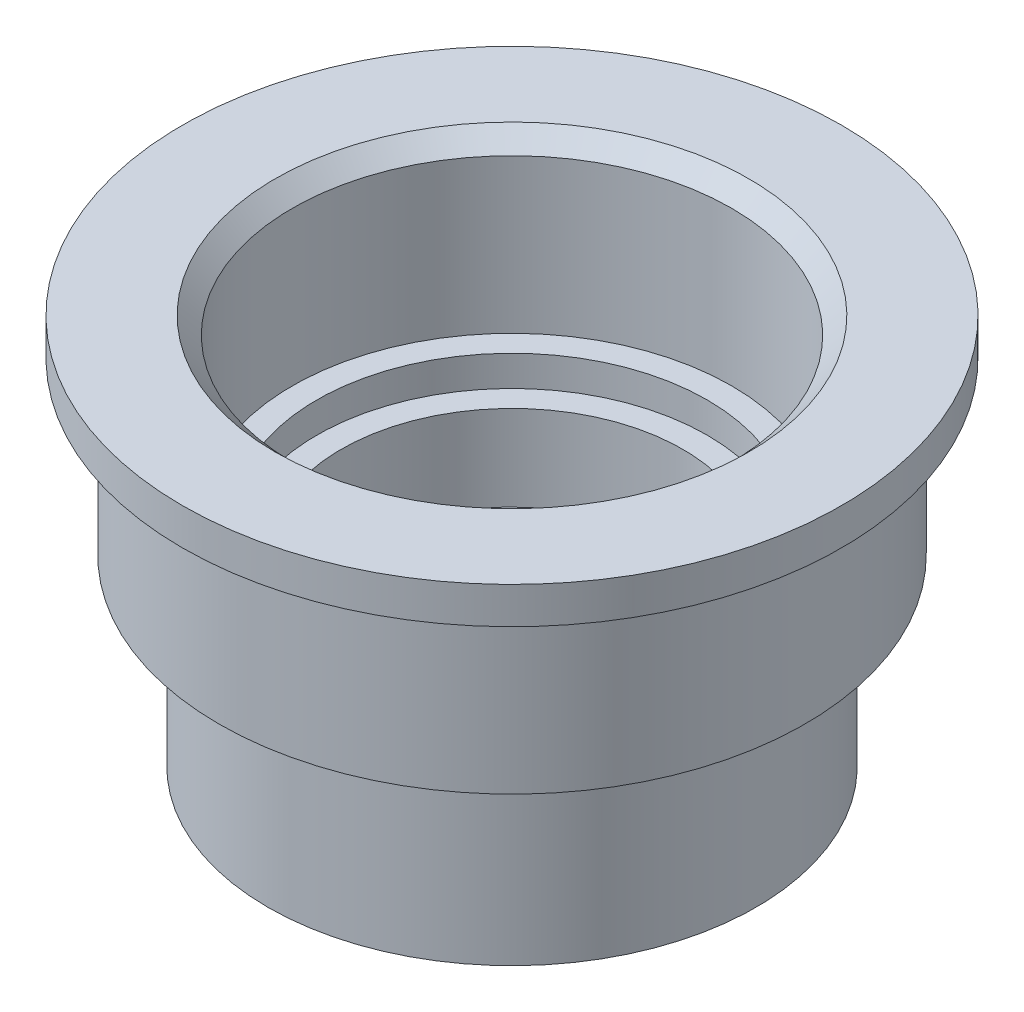
ISO-10303-21;
HEADER;
FILE_DESCRIPTION(('STEP AP214'),'2;1');
FILE_NAME('part.step','',(''),(''),'','','');
FILE_SCHEMA(('AUTOMOTIVE_DESIGN { 1 0 10303 214 1 1 1 1 }'));
ENDSEC;
DATA;
#1=APPLICATION_CONTEXT('core data for automotive mechanical design processes');
#2=APPLICATION_PROTOCOL_DEFINITION('international standard','automotive_design',2000,#1);
#3=PRODUCT_CONTEXT('',#1,'mechanical');
#4=PRODUCT('Part','Part','',(#3));
#5=PRODUCT_RELATED_PRODUCT_CATEGORY('part','',(#4));
#6=PRODUCT_DEFINITION_FORMATION('','',#4);
#7=PRODUCT_DEFINITION_CONTEXT('part definition',#1,'design');
#8=PRODUCT_DEFINITION('design','',#6,#7);
#9=PRODUCT_DEFINITION_SHAPE('','',#8);
#10=(LENGTH_UNIT() NAMED_UNIT(*) SI_UNIT(.MILLI.,.METRE.));
#11=(NAMED_UNIT(*) PLANE_ANGLE_UNIT() SI_UNIT($,.RADIAN.));
#12=(NAMED_UNIT(*) SI_UNIT($,.STERADIAN.) SOLID_ANGLE_UNIT());
#13=UNCERTAINTY_MEASURE_WITH_UNIT(LENGTH_MEASURE(1.E-05),#10,'distance_accuracy_value','');
#14=(GEOMETRIC_REPRESENTATION_CONTEXT(3) GLOBAL_UNCERTAINTY_ASSIGNED_CONTEXT((#13)) GLOBAL_UNIT_ASSIGNED_CONTEXT((#10,
#11,#12)) REPRESENTATION_CONTEXT('',''));
#15=CARTESIAN_POINT('',(0.,0.,0.));
#16=DIRECTION('',(0.,0.,1.));
#17=DIRECTION('',(1.,0.,0.));
#18=AXIS2_PLACEMENT_3D('',#15,#16,#17);
#19=CARTESIAN_POINT('',(0.,21.5,0.));
#20=DIRECTION('',(0.,-1.,0.));
#21=DIRECTION('',(0.,0.,-1.));
#22=AXIS2_PLACEMENT_3D('',#19,#20,#21);
#23=CYLINDRICAL_SURFACE('',#22,5.5);
#24=CARTESIAN_POINT('',(0.,0.,0.));
#25=DIRECTION('',(0.,-1.,0.));
#26=DIRECTION('',(0.,0.,-1.));
#27=AXIS2_PLACEMENT_3D('',#24,#25,#26);
#28=CIRCLE('',#27,5.5);
#29=CARTESIAN_POINT('',(0.,0.,-5.5));
#30=VERTEX_POINT('',#29);
#31=EDGE_CURVE('E76',#30,#30,#28,.T.);
#32=ORIENTED_EDGE('',*,*,#31,.T.);
#33=EDGE_LOOP('',(#32));
#34=FACE_BOUND('',#33,.T.);
#35=CARTESIAN_POINT('',(0.,4.25,0.));
#36=DIRECTION('',(0.,1.,0.));
#37=DIRECTION('',(0.,0.,1.));
#38=AXIS2_PLACEMENT_3D('',#35,#36,#37);
#39=CIRCLE('',#38,5.5);
#40=CARTESIAN_POINT('',(0.,4.25,5.5));
#41=VERTEX_POINT('',#40);
#42=EDGE_CURVE('E50',#41,#41,#39,.F.);
#43=ORIENTED_EDGE('',*,*,#42,.F.);
#44=EDGE_LOOP('',(#43));
#45=FACE_BOUND('',#44,.T.);
#46=ADVANCED_FACE('F45',(#34,#45),#23,.F.);
#47=CARTESIAN_POINT('',(0.,7.5,0.));
#48=DIRECTION('',(0.,-1.,0.));
#49=DIRECTION('',(0.,0.,-1.));
#50=AXIS2_PLACEMENT_3D('',#47,#48,#49);
#51=CYLINDRICAL_SURFACE('',#50,10.);
#52=CARTESIAN_POINT('',(0.,7.5,0.));
#53=DIRECTION('',(0.,1.,0.));
#54=DIRECTION('',(0.,0.,1.));
#55=AXIS2_PLACEMENT_3D('',#52,#53,#54);
#56=CIRCLE('',#55,10.);
#57=CARTESIAN_POINT('',(0.,7.5,10.));
#58=VERTEX_POINT('',#57);
#59=EDGE_CURVE('E58',#58,#58,#56,.T.);
#60=ORIENTED_EDGE('',*,*,#59,.F.);
#61=EDGE_LOOP('',(#60));
#62=FACE_BOUND('',#61,.T.);
#63=CARTESIAN_POINT('',(0.,0.,0.));
#64=DIRECTION('',(0.,1.,0.));
#65=DIRECTION('',(0.,0.,1.));
#66=AXIS2_PLACEMENT_3D('',#63,#64,#65);
#67=CIRCLE('',#66,10.);
#68=CARTESIAN_POINT('',(0.,0.,10.));
#69=VERTEX_POINT('',#68);
#70=EDGE_CURVE('E61',#69,#69,#67,.T.);
#71=ORIENTED_EDGE('',*,*,#70,.T.);
#72=EDGE_LOOP('',(#71));
#73=FACE_BOUND('',#72,.T.);
#74=ADVANCED_FACE('F103',(#62,#73),#51,.T.);
#75=CARTESIAN_POINT('',(0.,0.,0.));
#76=DIRECTION('',(0.,1.,0.));
#77=DIRECTION('',(0.,0.,1.));
#78=AXIS2_PLACEMENT_3D('',#75,#76,#77);
#79=PLANE('',#78);
#80=ORIENTED_EDGE('',*,*,#31,.F.);
#81=EDGE_LOOP('',(#80));
#82=FACE_BOUND('',#81,.T.);
#83=ORIENTED_EDGE('',*,*,#70,.F.);
#84=EDGE_LOOP('',(#83));
#85=FACE_BOUND('',#84,.T.);
#86=ADVANCED_FACE('F111',(#82,#85),#79,.F.);
#87=CARTESIAN_POINT('',(0.,14.5,0.));
#88=DIRECTION('',(0.,-1.,0.));
#89=DIRECTION('',(0.,0.,-1.));
#90=AXIS2_PLACEMENT_3D('',#87,#88,#89);
#91=CYLINDRICAL_SURFACE('',#90,12.);
#92=CARTESIAN_POINT('',(0.,14.5,0.));
#93=DIRECTION('',(0.,1.,0.));
#94=DIRECTION('',(0.,0.,1.));
#95=AXIS2_PLACEMENT_3D('',#92,#93,#94);
#96=CIRCLE('',#95,12.);
#97=CARTESIAN_POINT('',(0.,14.5,12.));
#98=VERTEX_POINT('',#97);
#99=EDGE_CURVE('E64',#98,#98,#96,.T.);
#100=ORIENTED_EDGE('',*,*,#99,.F.);
#101=EDGE_LOOP('',(#100));
#102=FACE_BOUND('',#101,.T.);
#103=CARTESIAN_POINT('',(0.,7.5,0.));
#104=DIRECTION('',(0.,1.,0.));
#105=DIRECTION('',(0.,0.,1.));
#106=AXIS2_PLACEMENT_3D('',#103,#104,#105);
#107=CIRCLE('',#106,12.);
#108=CARTESIAN_POINT('',(0.,7.5,12.));
#109=VERTEX_POINT('',#108);
#110=EDGE_CURVE('E67',#109,#109,#107,.T.);
#111=ORIENTED_EDGE('',*,*,#110,.T.);
#112=EDGE_LOOP('',(#111));
#113=FACE_BOUND('',#112,.T.);
#114=ADVANCED_FACE('F132',(#102,#113),#91,.T.);
#115=CARTESIAN_POINT('',(0.,7.5,0.));
#116=DIRECTION('',(0.,1.,0.));
#117=DIRECTION('',(0.,0.,1.));
#118=AXIS2_PLACEMENT_3D('',#115,#116,#117);
#119=PLANE('',#118);
#120=ORIENTED_EDGE('',*,*,#59,.T.);
#121=EDGE_LOOP('',(#120));
#122=FACE_BOUND('',#121,.T.);
#123=ORIENTED_EDGE('',*,*,#110,.F.);
#124=EDGE_LOOP('',(#123));
#125=FACE_BOUND('',#124,.T.);
#126=ADVANCED_FACE('F128',(#122,#125),#119,.F.);
#127=CARTESIAN_POINT('',(0.,16.,0.));
#128=DIRECTION('',(0.,-1.,0.));
#129=DIRECTION('',(0.,0.,-1.));
#130=AXIS2_PLACEMENT_3D('',#127,#128,#129);
#131=CYLINDRICAL_SURFACE('',#130,13.5);
#132=CARTESIAN_POINT('',(0.,16.,0.));
#133=DIRECTION('',(0.,1.,0.));
#134=DIRECTION('',(0.,0.,1.));
#135=AXIS2_PLACEMENT_3D('',#132,#133,#134);
#136=CIRCLE('',#135,13.5);
#137=CARTESIAN_POINT('',(0.,16.,13.5));
#138=VERTEX_POINT('',#137);
#139=EDGE_CURVE('E70',#138,#138,#136,.T.);
#140=ORIENTED_EDGE('',*,*,#139,.F.);
#141=EDGE_LOOP('',(#140));
#142=FACE_BOUND('',#141,.T.);
#143=CARTESIAN_POINT('',(0.,14.5,0.));
#144=DIRECTION('',(0.,1.,0.));
#145=DIRECTION('',(0.,0.,1.));
#146=AXIS2_PLACEMENT_3D('',#143,#144,#145);
#147=CIRCLE('',#146,13.5);
#148=CARTESIAN_POINT('',(0.,14.5,13.5));
#149=VERTEX_POINT('',#148);
#150=EDGE_CURVE('E73',#149,#149,#147,.T.);
#151=ORIENTED_EDGE('',*,*,#150,.T.);
#152=EDGE_LOOP('',(#151));
#153=FACE_BOUND('',#152,.T.);
#154=ADVANCED_FACE('F121',(#142,#153),#131,.T.);
#155=CARTESIAN_POINT('',(0.,16.,0.));
#156=DIRECTION('',(0.,1.,0.));
#157=DIRECTION('',(0.,0.,1.));
#158=AXIS2_PLACEMENT_3D('',#155,#156,#157);
#159=PLANE('',#158);
#160=CARTESIAN_POINT('',(0.,16.,0.));
#161=DIRECTION('',(0.,1.,0.));
#162=DIRECTION('',(0.,0.,1.));
#163=AXIS2_PLACEMENT_3D('',#160,#161,#162);
#164=CIRCLE('',#163,9.7);
#165=CARTESIAN_POINT('',(0.,16.,9.7));
#166=VERTEX_POINT('',#165);
#167=EDGE_CURVE('E10',#166,#166,#164,.F.);
#168=ORIENTED_EDGE('',*,*,#167,.T.);
#169=EDGE_LOOP('',(#168));
#170=FACE_BOUND('',#169,.T.);
#171=ORIENTED_EDGE('',*,*,#139,.T.);
#172=EDGE_LOOP('',(#171));
#173=FACE_BOUND('',#172,.T.);
#174=ADVANCED_FACE('F117',(#170,#173),#159,.T.);
#175=CARTESIAN_POINT('',(0.,14.5,0.));
#176=DIRECTION('',(0.,1.,0.));
#177=DIRECTION('',(0.,0.,1.));
#178=AXIS2_PLACEMENT_3D('',#175,#176,#177);
#179=PLANE('',#178);
#180=ORIENTED_EDGE('',*,*,#99,.T.);
#181=EDGE_LOOP('',(#180));
#182=FACE_BOUND('',#181,.T.);
#183=ORIENTED_EDGE('',*,*,#150,.F.);
#184=EDGE_LOOP('',(#183));
#185=FACE_BOUND('',#184,.T.);
#186=ADVANCED_FACE('F120',(#182,#185),#179,.F.);
#187=CARTESIAN_POINT('',(0.,9.,0.));
#188=DIRECTION('',(0.,1.,0.));
#189=DIRECTION('',(0.,0.,1.));
#190=AXIS2_PLACEMENT_3D('',#187,#188,#189);
#191=PLANE('',#190);
#192=CARTESIAN_POINT('',(0.,9.,0.));
#193=DIRECTION('',(0.,1.,0.));
#194=DIRECTION('',(0.,0.,1.));
#195=AXIS2_PLACEMENT_3D('',#192,#193,#194);
#196=CIRCLE('',#195,8.);
#197=CARTESIAN_POINT('',(0.,9.,8.));
#198=VERTEX_POINT('',#197);
#199=EDGE_CURVE('E85',#198,#198,#196,.T.);
#200=ORIENTED_EDGE('',*,*,#199,.F.);
#201=EDGE_LOOP('',(#200));
#202=FACE_BOUND('',#201,.T.);
#203=CARTESIAN_POINT('',(0.,9.,0.));
#204=DIRECTION('',(0.,1.,0.));
#205=DIRECTION('',(0.,0.,1.));
#206=AXIS2_PLACEMENT_3D('',#203,#204,#205);
#207=CIRCLE('',#206,9.);
#208=CARTESIAN_POINT('',(0.,9.,9.));
#209=VERTEX_POINT('',#208);
#210=EDGE_CURVE('E81',#209,#209,#207,.T.);
#211=ORIENTED_EDGE('',*,*,#210,.T.);
#212=EDGE_LOOP('',(#211));
#213=FACE_BOUND('',#212,.T.);
#214=ADVANCED_FACE('F124',(#202,#213),#191,.T.);
#215=CARTESIAN_POINT('',(0.,9.,0.));
#216=DIRECTION('',(0.,1.,0.));
#217=DIRECTION('',(0.,0.,1.));
#218=AXIS2_PLACEMENT_3D('',#215,#216,#217);
#219=CYLINDRICAL_SURFACE('',#218,9.);
#220=CARTESIAN_POINT('',(0.,15.3,0.));
#221=DIRECTION('',(0.,1.,0.));
#222=DIRECTION('',(0.,0.,1.));
#223=AXIS2_PLACEMENT_3D('',#220,#221,#222);
#224=CIRCLE('',#223,9.);
#225=CARTESIAN_POINT('',(0.,15.3,9.));
#226=VERTEX_POINT('',#225);
#227=EDGE_CURVE('E54',#226,#226,#224,.T.);
#228=ORIENTED_EDGE('',*,*,#227,.T.);
#229=EDGE_LOOP('',(#228));
#230=FACE_BOUND('',#229,.T.);
#231=ORIENTED_EDGE('',*,*,#210,.F.);
#232=EDGE_LOOP('',(#231));
#233=FACE_BOUND('',#232,.T.);
#234=ADVANCED_FACE('F115',(#230,#233),#219,.F.);
#235=CARTESIAN_POINT('',(0.,15.3,0.));
#236=DIRECTION('',(0.,1.,0.));
#237=DIRECTION('',(0.,0.,1.));
#238=AXIS2_PLACEMENT_3D('',#235,#236,#237);
#239=CONICAL_SURFACE('',#238,9.,0.785398163397451);
#240=ORIENTED_EDGE('',*,*,#167,.F.);
#241=EDGE_LOOP('',(#240));
#242=FACE_BOUND('',#241,.T.);
#243=ORIENTED_EDGE('',*,*,#227,.F.);
#244=EDGE_LOOP('',(#243));
#245=FACE_BOUND('',#244,.T.);
#246=ADVANCED_FACE('F48',(#242,#245),#239,.F.);
#247=CARTESIAN_POINT('',(0.,7.75,0.));
#248=DIRECTION('',(0.,1.,0.));
#249=DIRECTION('',(0.,0.,1.));
#250=AXIS2_PLACEMENT_3D('',#247,#248,#249);
#251=PLANE('',#250);
#252=CARTESIAN_POINT('',(0.,7.75,0.));
#253=DIRECTION('',(0.,1.,0.));
#254=DIRECTION('',(0.,0.,1.));
#255=AXIS2_PLACEMENT_3D('',#252,#253,#254);
#256=CIRCLE('',#255,7.);
#257=CARTESIAN_POINT('',(0.,7.75,7.));
#258=VERTEX_POINT('',#257);
#259=EDGE_CURVE('E90',#258,#258,#256,.T.);
#260=ORIENTED_EDGE('',*,*,#259,.F.);
#261=EDGE_LOOP('',(#260));
#262=FACE_BOUND('',#261,.T.);
#263=CARTESIAN_POINT('',(0.,7.75,0.));
#264=DIRECTION('',(0.,1.,0.));
#265=DIRECTION('',(0.,0.,1.));
#266=AXIS2_PLACEMENT_3D('',#263,#264,#265);
#267=CIRCLE('',#266,8.);
#268=CARTESIAN_POINT('',(0.,7.75,8.));
#269=VERTEX_POINT('',#268);
#270=EDGE_CURVE('E84',#269,#269,#267,.T.);
#271=ORIENTED_EDGE('',*,*,#270,.T.);
#272=EDGE_LOOP('',(#271));
#273=FACE_BOUND('',#272,.T.);
#274=ADVANCED_FACE('F170',(#262,#273),#251,.T.);
#275=CARTESIAN_POINT('',(0.,7.75,0.));
#276=DIRECTION('',(0.,1.,0.));
#277=DIRECTION('',(0.,0.,1.));
#278=AXIS2_PLACEMENT_3D('',#275,#276,#277);
#279=CYLINDRICAL_SURFACE('',#278,8.);
#280=ORIENTED_EDGE('',*,*,#270,.F.);
#281=EDGE_LOOP('',(#280));
#282=FACE_BOUND('',#281,.T.);
#283=ORIENTED_EDGE('',*,*,#199,.T.);
#284=EDGE_LOOP('',(#283));
#285=FACE_BOUND('',#284,.T.);
#286=ADVANCED_FACE('F181',(#282,#285),#279,.F.);
#287=CARTESIAN_POINT('',(0.,4.25,0.));
#288=DIRECTION('',(0.,1.,0.));
#289=DIRECTION('',(0.,0.,1.));
#290=AXIS2_PLACEMENT_3D('',#287,#288,#289);
#291=PLANE('',#290);
#292=CARTESIAN_POINT('',(0.,4.25,0.));
#293=DIRECTION('',(0.,1.,0.));
#294=DIRECTION('',(0.,0.,1.));
#295=AXIS2_PLACEMENT_3D('',#292,#293,#294);
#296=CIRCLE('',#295,7.);
#297=CARTESIAN_POINT('',(0.,4.25,7.));
#298=VERTEX_POINT('',#297);
#299=EDGE_CURVE('E93',#298,#298,#296,.T.);
#300=ORIENTED_EDGE('',*,*,#299,.T.);
#301=EDGE_LOOP('',(#300));
#302=FACE_BOUND('',#301,.T.);
#303=ORIENTED_EDGE('',*,*,#42,.T.);
#304=EDGE_LOOP('',(#303));
#305=FACE_BOUND('',#304,.T.);
#306=ADVANCED_FACE('F100',(#302,#305),#291,.T.);
#307=CARTESIAN_POINT('',(0.,4.25,0.));
#308=DIRECTION('',(0.,1.,0.));
#309=DIRECTION('',(0.,0.,1.));
#310=AXIS2_PLACEMENT_3D('',#307,#308,#309);
#311=CYLINDRICAL_SURFACE('',#310,7.);
#312=ORIENTED_EDGE('',*,*,#299,.F.);
#313=EDGE_LOOP('',(#312));
#314=FACE_BOUND('',#313,.T.);
#315=ORIENTED_EDGE('',*,*,#259,.T.);
#316=EDGE_LOOP('',(#315));
#317=FACE_BOUND('',#316,.T.);
#318=ADVANCED_FACE('F203',(#314,#317),#311,.F.);
#319=CLOSED_SHELL('',(#46,#74,#86,#114,#126,#154,#174,#186,#214,#234,#246,#274,#286,#306,#318));
#320=MANIFOLD_SOLID_BREP('B2',#319);
#321=ADVANCED_BREP_SHAPE_REPRESENTATION('',(#18,#320),#14);
#322=SHAPE_DEFINITION_REPRESENTATION(#9,#321);
ENDSEC;
END-ISO-10303-21;
